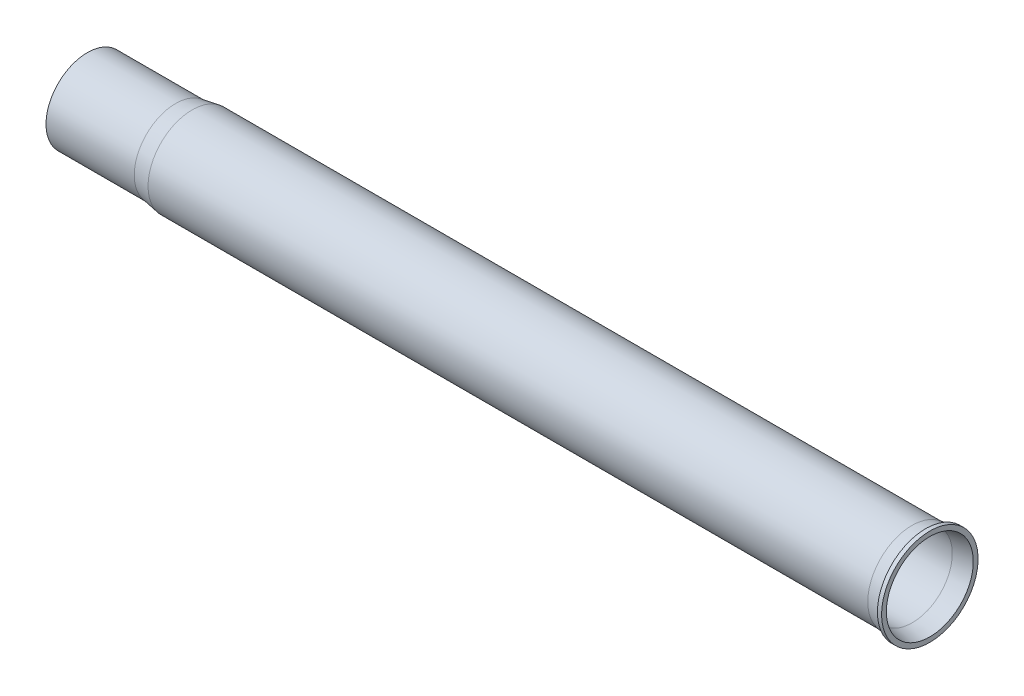
ISO-10303-21;
HEADER;
FILE_DESCRIPTION(('STEP AP214'),'2;1');
FILE_NAME('part.step','',(''),(''),'','','');
FILE_SCHEMA(('AUTOMOTIVE_DESIGN { 1 0 10303 214 1 1 1 1 }'));
ENDSEC;
DATA;
#1=APPLICATION_CONTEXT('core data for automotive mechanical design processes');
#2=APPLICATION_PROTOCOL_DEFINITION('international standard','automotive_design',2000,#1);
#3=PRODUCT_CONTEXT('',#1,'mechanical');
#4=PRODUCT('Part','Part','',(#3));
#5=PRODUCT_RELATED_PRODUCT_CATEGORY('part','',(#4));
#6=PRODUCT_DEFINITION_FORMATION('','',#4);
#7=PRODUCT_DEFINITION_CONTEXT('part definition',#1,'design');
#8=PRODUCT_DEFINITION('design','',#6,#7);
#9=PRODUCT_DEFINITION_SHAPE('','',#8);
#10=(LENGTH_UNIT() NAMED_UNIT(*) SI_UNIT(.MILLI.,.METRE.));
#11=(NAMED_UNIT(*) PLANE_ANGLE_UNIT() SI_UNIT($,.RADIAN.));
#12=(NAMED_UNIT(*) SI_UNIT($,.STERADIAN.) SOLID_ANGLE_UNIT());
#13=UNCERTAINTY_MEASURE_WITH_UNIT(LENGTH_MEASURE(1.E-05),#10,'distance_accuracy_value','');
#14=(GEOMETRIC_REPRESENTATION_CONTEXT(3) GLOBAL_UNCERTAINTY_ASSIGNED_CONTEXT((#13)) GLOBAL_UNIT_ASSIGNED_CONTEXT((#10,
#11,#12)) REPRESENTATION_CONTEXT('',''));
#15=CARTESIAN_POINT('',(0.,0.,0.));
#16=DIRECTION('',(0.,0.,1.));
#17=DIRECTION('',(1.,0.,0.));
#18=AXIS2_PLACEMENT_3D('',#15,#16,#17);
#19=CARTESIAN_POINT('',(0.,15.,0.));
#20=DIRECTION('',(1.,0.,0.));
#21=DIRECTION('',(0.,0.,-1.));
#22=AXIS2_PLACEMENT_3D('',#19,#20,#21);
#23=PLANE('',#22);
#24=CARTESIAN_POINT('',(0.,0.,0.));
#25=DIRECTION('',(-1.,0.,0.));
#26=DIRECTION('',(0.,0.,1.));
#27=AXIS2_PLACEMENT_3D('',#24,#25,#26);
#28=CIRCLE('',#27,13.5);
#29=CARTESIAN_POINT('',(0.,0.,13.5));
#30=VERTEX_POINT('',#29);
#31=EDGE_CURVE('E10',#30,#30,#28,.T.);
#32=ORIENTED_EDGE('',*,*,#31,.F.);
#33=EDGE_LOOP('',(#32));
#34=FACE_BOUND('',#33,.T.);
#35=CARTESIAN_POINT('',(0.,0.,0.));
#36=DIRECTION('',(-1.,0.,0.));
#37=DIRECTION('',(0.,0.,1.));
#38=AXIS2_PLACEMENT_3D('',#35,#36,#37);
#39=CIRCLE('',#38,15.);
#40=CARTESIAN_POINT('',(0.,0.,15.));
#41=VERTEX_POINT('',#40);
#42=EDGE_CURVE('E71',#41,#41,#39,.T.);
#43=ORIENTED_EDGE('',*,*,#42,.T.);
#44=EDGE_LOOP('',(#43));
#45=FACE_BOUND('',#44,.T.);
#46=ADVANCED_FACE('F31',(#34,#45),#23,.F.);
#47=CARTESIAN_POINT('',(0.,0.,0.));
#48=DIRECTION('',(-1.,0.,0.));
#49=DIRECTION('',(0.,0.,1.));
#50=AXIS2_PLACEMENT_3D('',#47,#48,#49);
#51=CYLINDRICAL_SURFACE('',#50,13.5);
#52=CARTESIAN_POINT('',(32.1241437954473,0.,0.));
#53=DIRECTION('',(-1.,0.,0.));
#54=DIRECTION('',(0.,0.,1.));
#55=AXIS2_PLACEMENT_3D('',#52,#53,#54);
#56=CIRCLE('',#55,13.5);
#57=CARTESIAN_POINT('',(32.1241437954473,0.,13.5));
#58=VERTEX_POINT('',#57);
#59=EDGE_CURVE('E37',#58,#58,#56,.T.);
#60=ORIENTED_EDGE('',*,*,#59,.F.);
#61=EDGE_LOOP('',(#60));
#62=FACE_BOUND('',#61,.T.);
#63=ORIENTED_EDGE('',*,*,#31,.T.);
#64=EDGE_LOOP('',(#63));
#65=FACE_BOUND('',#64,.T.);
#66=ADVANCED_FACE('F132',(#62,#65),#51,.F.);
#67=CARTESIAN_POINT('',(32.1241437954473,0.,0.));
#68=DIRECTION('',(1.,0.,0.));
#69=DIRECTION('',(0.,0.,-1.));
#70=AXIS2_PLACEMENT_3D('',#67,#68,#69);
#71=CONICAL_SURFACE('',#70,13.5,0.165148677414625);
#72=CARTESIAN_POINT('',(38.1241437954473,0.,0.));
#73=DIRECTION('',(-1.,0.,0.));
#74=DIRECTION('',(0.,0.,1.));
#75=AXIS2_PLACEMENT_3D('',#72,#73,#74);
#76=CIRCLE('',#75,14.5);
#77=CARTESIAN_POINT('',(38.1241437954473,0.,14.5));
#78=VERTEX_POINT('',#77);
#79=EDGE_CURVE('E41',#78,#78,#76,.T.);
#80=ORIENTED_EDGE('',*,*,#79,.F.);
#81=EDGE_LOOP('',(#80));
#82=FACE_BOUND('',#81,.T.);
#83=ORIENTED_EDGE('',*,*,#59,.T.);
#84=EDGE_LOOP('',(#83));
#85=FACE_BOUND('',#84,.T.);
#86=ADVANCED_FACE('F127',(#82,#85),#71,.F.);
#87=CARTESIAN_POINT('',(0.,0.,0.));
#88=DIRECTION('',(-1.,0.,0.));
#89=DIRECTION('',(0.,0.,1.));
#90=AXIS2_PLACEMENT_3D('',#87,#88,#89);
#91=CYLINDRICAL_SURFACE('',#90,14.5);
#92=CARTESIAN_POINT('',(299.148529270389,0.,0.));
#93=DIRECTION('',(-1.,0.,0.));
#94=DIRECTION('',(0.,0.,1.));
#95=AXIS2_PLACEMENT_3D('',#92,#93,#94);
#96=CIRCLE('',#95,14.5);
#97=CARTESIAN_POINT('',(299.148529270389,0.,14.5));
#98=VERTEX_POINT('',#97);
#99=EDGE_CURVE('E45',#98,#98,#96,.T.);
#100=ORIENTED_EDGE('',*,*,#99,.F.);
#101=EDGE_LOOP('',(#100));
#102=FACE_BOUND('',#101,.T.);
#103=ORIENTED_EDGE('',*,*,#79,.T.);
#104=EDGE_LOOP('',(#103));
#105=FACE_BOUND('',#104,.T.);
#106=ADVANCED_FACE('F121',(#102,#105),#91,.F.);
#107=CARTESIAN_POINT('',(299.148529270389,0.,0.));
#108=DIRECTION('',(1.,0.,0.));
#109=DIRECTION('',(0.,0.,-1.));
#110=AXIS2_PLACEMENT_3D('',#107,#108,#109);
#111=CONICAL_SURFACE('',#110,14.5,0.197395559849881);
#112=CARTESIAN_POINT('',(305.5,0.,0.));
#113=DIRECTION('',(-1.,0.,0.));
#114=DIRECTION('',(0.,0.,1.));
#115=AXIS2_PLACEMENT_3D('',#112,#113,#114);
#116=CIRCLE('',#115,15.7702941459222);
#117=CARTESIAN_POINT('',(305.5,0.,15.7702941459222));
#118=VERTEX_POINT('',#117);
#119=EDGE_CURVE('E50',#118,#118,#116,.T.);
#120=ORIENTED_EDGE('',*,*,#119,.F.);
#121=EDGE_LOOP('',(#120));
#122=FACE_BOUND('',#121,.T.);
#123=ORIENTED_EDGE('',*,*,#99,.T.);
#124=EDGE_LOOP('',(#123));
#125=FACE_BOUND('',#124,.T.);
#126=ADVANCED_FACE('F115',(#122,#125),#111,.F.);
#127=CARTESIAN_POINT('',(305.5,17.5,0.));
#128=DIRECTION('',(-1.,0.,0.));
#129=DIRECTION('',(0.,0.,1.));
#130=AXIS2_PLACEMENT_3D('',#127,#128,#129);
#131=PLANE('',#130);
#132=CARTESIAN_POINT('',(305.5,0.,0.));
#133=DIRECTION('',(-1.,0.,0.));
#134=DIRECTION('',(0.,0.,1.));
#135=AXIS2_PLACEMENT_3D('',#132,#133,#134);
#136=CIRCLE('',#135,17.5);
#137=CARTESIAN_POINT('',(305.5,0.,17.5));
#138=VERTEX_POINT('',#137);
#139=EDGE_CURVE('E53',#138,#138,#136,.T.);
#140=ORIENTED_EDGE('',*,*,#139,.F.);
#141=EDGE_LOOP('',(#140));
#142=FACE_BOUND('',#141,.T.);
#143=ORIENTED_EDGE('',*,*,#119,.T.);
#144=EDGE_LOOP('',(#143));
#145=FACE_BOUND('',#144,.T.);
#146=ADVANCED_FACE('F109',(#142,#145),#131,.F.);
#147=CARTESIAN_POINT('',(0.,0.,0.));
#148=DIRECTION('',(-1.,0.,0.));
#149=DIRECTION('',(0.,0.,1.));
#150=AXIS2_PLACEMENT_3D('',#147,#148,#149);
#151=CYLINDRICAL_SURFACE('',#150,17.5);
#152=CARTESIAN_POINT('',(304.,0.,0.));
#153=DIRECTION('',(-1.,0.,0.));
#154=DIRECTION('',(0.,0.,1.));
#155=AXIS2_PLACEMENT_3D('',#152,#153,#154);
#156=CIRCLE('',#155,17.5);
#157=CARTESIAN_POINT('',(304.,0.,17.5));
#158=VERTEX_POINT('',#157);
#159=EDGE_CURVE('E56',#158,#158,#156,.T.);
#160=ORIENTED_EDGE('',*,*,#159,.F.);
#161=EDGE_LOOP('',(#160));
#162=FACE_BOUND('',#161,.T.);
#163=ORIENTED_EDGE('',*,*,#139,.T.);
#164=EDGE_LOOP('',(#163));
#165=FACE_BOUND('',#164,.T.);
#166=ADVANCED_FACE('F103',(#162,#165),#151,.T.);
#167=CARTESIAN_POINT('',(304.,17.,0.));
#168=DIRECTION('',(1.,0.,0.));
#169=DIRECTION('',(0.,0.,-1.));
#170=AXIS2_PLACEMENT_3D('',#167,#168,#169);
#171=PLANE('',#170);
#172=CARTESIAN_POINT('',(304.,0.,0.));
#173=DIRECTION('',(-1.,0.,0.));
#174=DIRECTION('',(0.,0.,1.));
#175=AXIS2_PLACEMENT_3D('',#172,#173,#174);
#176=CIRCLE('',#175,17.);
#177=CARTESIAN_POINT('',(304.,0.,17.));
#178=VERTEX_POINT('',#177);
#179=EDGE_CURVE('E59',#178,#178,#176,.T.);
#180=ORIENTED_EDGE('',*,*,#179,.F.);
#181=EDGE_LOOP('',(#180));
#182=FACE_BOUND('',#181,.T.);
#183=ORIENTED_EDGE('',*,*,#159,.T.);
#184=EDGE_LOOP('',(#183));
#185=FACE_BOUND('',#184,.T.);
#186=ADVANCED_FACE('F97',(#182,#185),#171,.F.);
#187=CARTESIAN_POINT('',(304.,0.,0.));
#188=DIRECTION('',(1.,0.,0.));
#189=DIRECTION('',(0.,0.,-1.));
#190=AXIS2_PLACEMENT_3D('',#187,#188,#189);
#191=CONICAL_SURFACE('',#190,17.,0.197395559849881);
#192=CARTESIAN_POINT('',(299.,0.,0.));
#193=DIRECTION('',(-1.,0.,0.));
#194=DIRECTION('',(0.,0.,1.));
#195=AXIS2_PLACEMENT_3D('',#192,#193,#194);
#196=CIRCLE('',#195,16.);
#197=CARTESIAN_POINT('',(299.,0.,16.));
#198=VERTEX_POINT('',#197);
#199=EDGE_CURVE('E62',#198,#198,#196,.T.);
#200=ORIENTED_EDGE('',*,*,#199,.F.);
#201=EDGE_LOOP('',(#200));
#202=FACE_BOUND('',#201,.T.);
#203=ORIENTED_EDGE('',*,*,#179,.T.);
#204=EDGE_LOOP('',(#203));
#205=FACE_BOUND('',#204,.T.);
#206=ADVANCED_FACE('F91',(#202,#205),#191,.T.);
#207=CARTESIAN_POINT('',(0.,0.,0.));
#208=DIRECTION('',(-1.,0.,0.));
#209=DIRECTION('',(0.,0.,1.));
#210=AXIS2_PLACEMENT_3D('',#207,#208,#209);
#211=CYLINDRICAL_SURFACE('',#210,16.);
#212=CARTESIAN_POINT('',(38.,0.,0.));
#213=DIRECTION('',(-1.,0.,0.));
#214=DIRECTION('',(0.,0.,1.));
#215=AXIS2_PLACEMENT_3D('',#212,#213,#214);
#216=CIRCLE('',#215,16.);
#217=CARTESIAN_POINT('',(38.,0.,16.));
#218=VERTEX_POINT('',#217);
#219=EDGE_CURVE('E65',#218,#218,#216,.T.);
#220=ORIENTED_EDGE('',*,*,#219,.F.);
#221=EDGE_LOOP('',(#220));
#222=FACE_BOUND('',#221,.T.);
#223=ORIENTED_EDGE('',*,*,#199,.T.);
#224=EDGE_LOOP('',(#223));
#225=FACE_BOUND('',#224,.T.);
#226=ADVANCED_FACE('F85',(#222,#225),#211,.T.);
#227=CARTESIAN_POINT('',(38.,0.,0.));
#228=DIRECTION('',(1.,0.,0.));
#229=DIRECTION('',(0.,0.,-1.));
#230=AXIS2_PLACEMENT_3D('',#227,#228,#229);
#231=CONICAL_SURFACE('',#230,16.,0.165148677414625);
#232=CARTESIAN_POINT('',(32.,0.,0.));
#233=DIRECTION('',(-1.,0.,0.));
#234=DIRECTION('',(0.,0.,1.));
#235=AXIS2_PLACEMENT_3D('',#232,#233,#234);
#236=CIRCLE('',#235,15.);
#237=CARTESIAN_POINT('',(32.,0.,15.));
#238=VERTEX_POINT('',#237);
#239=EDGE_CURVE('E68',#238,#238,#236,.T.);
#240=ORIENTED_EDGE('',*,*,#239,.F.);
#241=EDGE_LOOP('',(#240));
#242=FACE_BOUND('',#241,.T.);
#243=ORIENTED_EDGE('',*,*,#219,.T.);
#244=EDGE_LOOP('',(#243));
#245=FACE_BOUND('',#244,.T.);
#246=ADVANCED_FACE('F79',(#242,#245),#231,.T.);
#247=CARTESIAN_POINT('',(0.,0.,0.));
#248=DIRECTION('',(-1.,0.,0.));
#249=DIRECTION('',(0.,0.,1.));
#250=AXIS2_PLACEMENT_3D('',#247,#248,#249);
#251=CYLINDRICAL_SURFACE('',#250,15.);
#252=ORIENTED_EDGE('',*,*,#42,.F.);
#253=EDGE_LOOP('',(#252));
#254=FACE_BOUND('',#253,.T.);
#255=ORIENTED_EDGE('',*,*,#239,.T.);
#256=EDGE_LOOP('',(#255));
#257=FACE_BOUND('',#256,.T.);
#258=ADVANCED_FACE('F76',(#254,#257),#251,.T.);
#259=CLOSED_SHELL('',(#46,#66,#86,#106,#126,#146,#166,#186,#206,#226,#246,#258));
#260=MANIFOLD_SOLID_BREP('B2',#259);
#261=ADVANCED_BREP_SHAPE_REPRESENTATION('',(#18,#260),#14);
#262=SHAPE_DEFINITION_REPRESENTATION(#9,#261);
ENDSEC;
END-ISO-10303-21;
